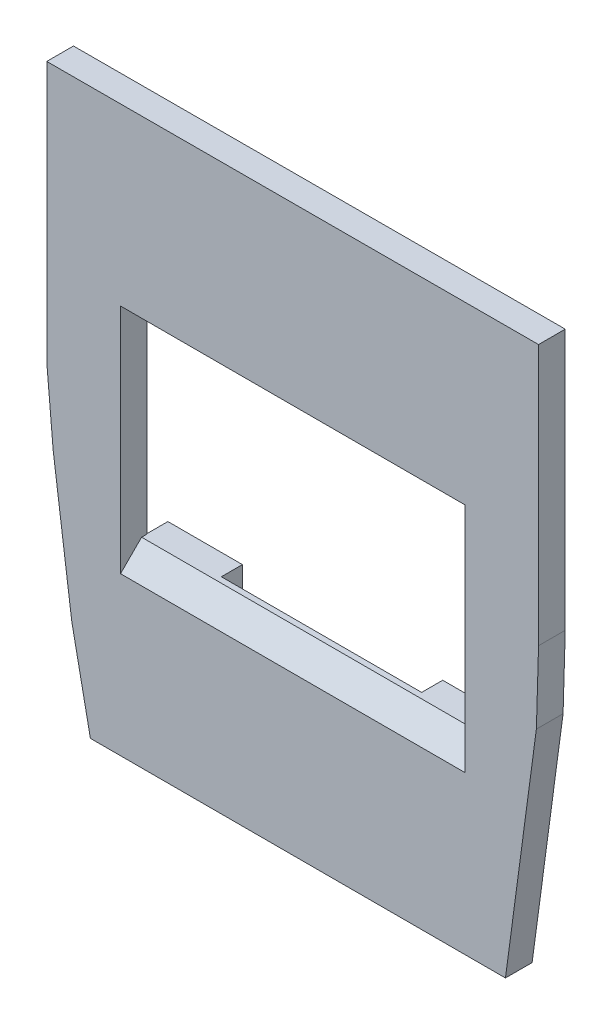
ISO-10303-21;
HEADER;
FILE_DESCRIPTION(('STEP AP214'),'2;1');
FILE_NAME('part.step','',(''),(''),'','','');
FILE_SCHEMA(('AUTOMOTIVE_DESIGN { 1 0 10303 214 1 1 1 1 }'));
ENDSEC;
DATA;
#1=APPLICATION_CONTEXT('core data for automotive mechanical design processes');
#2=APPLICATION_PROTOCOL_DEFINITION('international standard','automotive_design',2000,#1);
#3=PRODUCT_CONTEXT('',#1,'mechanical');
#4=PRODUCT('Part','Part','',(#3));
#5=PRODUCT_RELATED_PRODUCT_CATEGORY('part','',(#4));
#6=PRODUCT_DEFINITION_FORMATION('','',#4);
#7=PRODUCT_DEFINITION_CONTEXT('part definition',#1,'design');
#8=PRODUCT_DEFINITION('design','',#6,#7);
#9=PRODUCT_DEFINITION_SHAPE('','',#8);
#10=(LENGTH_UNIT() NAMED_UNIT(*) SI_UNIT(.MILLI.,.METRE.));
#11=(NAMED_UNIT(*) PLANE_ANGLE_UNIT() SI_UNIT($,.RADIAN.));
#12=(NAMED_UNIT(*) SI_UNIT($,.STERADIAN.) SOLID_ANGLE_UNIT());
#13=UNCERTAINTY_MEASURE_WITH_UNIT(LENGTH_MEASURE(1.E-05),#10,'distance_accuracy_value','');
#14=(GEOMETRIC_REPRESENTATION_CONTEXT(3) GLOBAL_UNCERTAINTY_ASSIGNED_CONTEXT((#13)) GLOBAL_UNIT_ASSIGNED_CONTEXT((#10,
#11,#12)) REPRESENTATION_CONTEXT('',''));
#15=CARTESIAN_POINT('',(0.,0.,0.));
#16=DIRECTION('',(0.,0.,1.));
#17=DIRECTION('',(1.,0.,0.));
#18=AXIS2_PLACEMENT_3D('',#15,#16,#17);
#19=CARTESIAN_POINT('',(0.,0.,0.));
#20=DIRECTION('',(0.,0.,1.));
#21=DIRECTION('',(1.,0.,0.));
#22=AXIS2_PLACEMENT_3D('',#19,#20,#21);
#23=PLANE('',#22);
#24=DIRECTION('',(0.,1.,0.));
#25=VECTOR('',#24,1.);
#26=CARTESIAN_POINT('',(10.6916820346461,10.5403601363045,0.));
#27=LINE('',#26,#25);
#28=CARTESIAN_POINT('',(10.6916820346461,10.5403601363045,0.));
#29=VERTEX_POINT('',#28);
#30=CARTESIAN_POINT('',(10.6916820346461,14.6221120483165,0.));
#31=VERTEX_POINT('',#30);
#32=EDGE_CURVE('E239',#29,#31,#27,.T.);
#33=ORIENTED_EDGE('',*,*,#32,.F.);
#34=DIRECTION('',(1.,0.,0.));
#35=VECTOR('',#34,1.);
#36=CARTESIAN_POINT('',(10.6916820346461,10.5403601363045,0.));
#37=LINE('',#36,#35);
#38=CARTESIAN_POINT('',(15.9958005098485,10.5403601363045,0.));
#39=VERTEX_POINT('',#38);
#40=EDGE_CURVE('E247',#29,#39,#37,.T.);
#41=ORIENTED_EDGE('',*,*,#40,.T.);
#42=DIRECTION('',(0.,1.,0.));
#43=VECTOR('',#42,1.);
#44=CARTESIAN_POINT('',(15.9958005098485,10.5403601363045,0.));
#45=LINE('',#44,#43);
#46=CARTESIAN_POINT('',(15.9958005098485,14.6221120483165,0.));
#47=VERTEX_POINT('',#46);
#48=EDGE_CURVE('E254',#39,#47,#45,.T.);
#49=ORIENTED_EDGE('',*,*,#48,.T.);
#50=DIRECTION('',(1.,0.,0.));
#51=VECTOR('',#50,1.);
#52=CARTESIAN_POINT('',(10.6916820346461,14.6221120483165,0.));
#53=LINE('',#52,#51);
#54=EDGE_CURVE('E48',#31,#47,#53,.T.);
#55=ORIENTED_EDGE('',*,*,#54,.F.);
#56=EDGE_LOOP('',(#33,#41,#49,#55));
#57=FACE_BOUND('',#56,.T.);
#58=DIRECTION('',(0.,-1.,0.));
#59=VECTOR('',#58,1.);
#60=CARTESIAN_POINT('',(5.47123590271081,20.6763208243746,0.));
#61=LINE('',#60,#59);
#62=CARTESIAN_POINT('',(5.47123590271081,20.6763208243746,0.));
#63=VERTEX_POINT('',#62);
#64=CARTESIAN_POINT('',(5.47123590271081,2.16473642803729,0.));
#65=VERTEX_POINT('',#64);
#66=EDGE_CURVE('E382',#63,#65,#61,.T.);
#67=ORIENTED_EDGE('',*,*,#66,.F.);
#68=DIRECTION('',(-0.999998972945766,-0.00143321575949112,0.));
#69=VECTOR('',#68,1.);
#70=CARTESIAN_POINT('',(5.47123590271081,20.6763208243746,0.));
#71=LINE('',#70,#69);
#72=CARTESIAN_POINT('',(40.4711999558126,20.7264833759568,0.));
#73=VERTEX_POINT('',#72);
#74=EDGE_CURVE('E387',#73,#63,#71,.T.);
#75=ORIENTED_EDGE('',*,*,#74,.F.);
#76=DIRECTION('',(0.,1.,0.));
#77=VECTOR('',#76,1.);
#78=CARTESIAN_POINT('',(40.4711999558126,20.7264833759568,0.));
#79=LINE('',#78,#77);
#80=CARTESIAN_POINT('',(40.4711999558126,2.16473642803729,0.));
#81=VERTEX_POINT('',#80);
#82=EDGE_CURVE('E420',#81,#73,#79,.T.);
#83=ORIENTED_EDGE('',*,*,#82,.F.);
#84=DIRECTION('',(0.0295630281202379,0.999562918163915,0.));
#85=VECTOR('',#84,1.);
#86=CARTESIAN_POINT('',(40.3168717193109,-3.05329407294369,0.));
#87=LINE('',#86,#85);
#88=CARTESIAN_POINT('',(40.3168717193109,-3.05329407294369,0.));
#89=VERTEX_POINT('',#88);
#90=EDGE_CURVE('E418',#89,#81,#87,.T.);
#91=ORIENTED_EDGE('',*,*,#90,.F.);
#92=DIRECTION('',(0.132706987579449,0.991155313484011,0.));
#93=VECTOR('',#92,1.);
#94=CARTESIAN_POINT('',(39.0061313007306,-12.8428865742156,0.));
#95=LINE('',#94,#93);
#96=CARTESIAN_POINT('',(38.1155746653007,-19.4942314450822,0.));
#97=VERTEX_POINT('',#96);
#98=EDGE_CURVE('E416',#97,#89,#95,.T.);
#99=ORIENTED_EDGE('',*,*,#98,.F.);
#100=DIRECTION('',(1.,0.,0.));
#101=VECTOR('',#100,1.);
#102=CARTESIAN_POINT('',(38.1155746653007,-19.4942314450822,0.));
#103=LINE('',#102,#101);
#104=CARTESIAN_POINT('',(8.57720643900902,-19.4942314450822,0.));
#105=VERTEX_POINT('',#104);
#106=EDGE_CURVE('E413',#105,#97,#103,.T.);
#107=ORIENTED_EDGE('',*,*,#106,.F.);
#108=DIRECTION('',(0.198501388642258,-0.980100606421144,0.));
#109=VECTOR('',#108,1.);
#110=CARTESIAN_POINT('',(7.25199234352178,-12.950986848614,0.));
#111=LINE('',#110,#109);
#112=CARTESIAN_POINT('',(7.25199234352178,-12.950986848614,0.));
#113=VERTEX_POINT('',#112);
#114=EDGE_CURVE('E410',#113,#105,#111,.T.);
#115=ORIENTED_EDGE('',*,*,#114,.F.);
#116=DIRECTION('',(0.132706987579449,-0.991155313484011,0.));
#117=VECTOR('',#116,1.);
#118=CARTESIAN_POINT('',(5.92677824803454,-3.05329407294369,0.));
#119=LINE('',#118,#117);
#120=CARTESIAN_POINT('',(5.92677824803454,-3.05329407294369,0.));
#121=VERTEX_POINT('',#120);
#122=EDGE_CURVE('E408',#121,#113,#119,.T.);
#123=ORIENTED_EDGE('',*,*,#122,.F.);
#124=DIRECTION('',(0.0869707895483825,-0.996210862099652,0.));
#125=VECTOR('',#124,1.);
#126=CARTESIAN_POINT('',(5.47123590271081,2.16473642803729,0.));
#127=LINE('',#126,#125);
#128=EDGE_CURVE('E406',#65,#121,#127,.T.);
#129=ORIENTED_EDGE('',*,*,#128,.F.);
#130=EDGE_LOOP('',(#67,#75,#83,#91,#99,#107,#115,#123,#129));
#131=FACE_BOUND('',#130,.T.);
#132=DIRECTION('',(-1.,0.,0.));
#133=VECTOR('',#132,1.);
#134=CARTESIAN_POINT('',(35.2211999558126,10.6820636087277,0.));
#135=LINE('',#134,#133);
#136=CARTESIAN_POINT('',(35.2211999558126,10.6820636087277,0.));
#137=VERTEX_POINT('',#136);
#138=CARTESIAN_POINT('',(30.2509607426466,10.6820636087277,0.));
#139=VERTEX_POINT('',#138);
#140=EDGE_CURVE('E333',#137,#139,#135,.T.);
#141=ORIENTED_EDGE('',*,*,#140,.F.);
#142=DIRECTION('',(0.,1.,0.));
#143=VECTOR('',#142,1.);
#144=CARTESIAN_POINT('',(35.2211999558126,10.6820636087277,0.));
#145=LINE('',#144,#143);
#146=CARTESIAN_POINT('',(35.2211999558126,14.6221120483165,0.));
#147=VERTEX_POINT('',#146);
#148=EDGE_CURVE('E320',#137,#147,#145,.T.);
#149=ORIENTED_EDGE('',*,*,#148,.T.);
#150=DIRECTION('',(-1.,0.,0.));
#151=VECTOR('',#150,1.);
#152=CARTESIAN_POINT('',(35.2211999558126,14.6221120483165,0.));
#153=LINE('',#152,#151);
#154=CARTESIAN_POINT('',(30.2509607426466,14.6221120483165,0.));
#155=VERTEX_POINT('',#154);
#156=EDGE_CURVE('E343',#147,#155,#153,.T.);
#157=ORIENTED_EDGE('',*,*,#156,.T.);
#158=DIRECTION('',(0.,1.,0.));
#159=VECTOR('',#158,1.);
#160=CARTESIAN_POINT('',(30.2509607426466,10.6820636087277,0.));
#161=LINE('',#160,#159);
#162=EDGE_CURVE('E346',#139,#155,#161,.T.);
#163=ORIENTED_EDGE('',*,*,#162,.F.);
#164=EDGE_LOOP('',(#141,#149,#157,#163));
#165=FACE_BOUND('',#164,.T.);
#166=DIRECTION('',(0.,-1.,0.));
#167=VECTOR('',#166,1.);
#168=CARTESIAN_POINT('',(35.2211999558126,-6.77351662404319,0.));
#169=LINE('',#168,#167);
#170=CARTESIAN_POINT('',(35.2211999558126,-6.77351662404319,0.));
#171=VERTEX_POINT('',#170);
#172=CARTESIAN_POINT('',(35.2211999558126,-11.7735166240432,0.));
#173=VERTEX_POINT('',#172);
#174=EDGE_CURVE('E282',#171,#173,#169,.T.);
#175=ORIENTED_EDGE('',*,*,#174,.F.);
#176=DIRECTION('',(0.,1.,0.));
#177=VECTOR('',#176,1.);
#178=CARTESIAN_POINT('',(35.2211999558126,-6.77351662404319,0.));
#179=LINE('',#178,#177);
#180=CARTESIAN_POINT('',(35.2211999558126,6.72648337595681,0.));
#181=VERTEX_POINT('',#180);
#182=EDGE_CURVE('E362',#171,#181,#179,.T.);
#183=ORIENTED_EDGE('',*,*,#182,.T.);
#184=DIRECTION('',(-1.,0.,0.));
#185=VECTOR('',#184,1.);
#186=CARTESIAN_POINT('',(35.2211999558126,6.72648337595681,0.));
#187=LINE('',#186,#185);
#188=CARTESIAN_POINT('',(10.7212359027108,6.72648337595681,0.));
#189=VERTEX_POINT('',#188);
#190=EDGE_CURVE('E351',#181,#189,#187,.T.);
#191=ORIENTED_EDGE('',*,*,#190,.T.);
#192=DIRECTION('',(0.,-1.,0.));
#193=VECTOR('',#192,1.);
#194=CARTESIAN_POINT('',(10.7212359027108,-6.77351662404319,0.));
#195=LINE('',#194,#193);
#196=CARTESIAN_POINT('',(10.7212359027108,-6.77351662404319,0.));
#197=VERTEX_POINT('',#196);
#198=EDGE_CURVE('E367',#189,#197,#195,.T.);
#199=ORIENTED_EDGE('',*,*,#198,.T.);
#200=DIRECTION('',(-1.,0.,0.));
#201=VECTOR('',#200,1.);
#202=CARTESIAN_POINT('',(15.9958005098485,-6.77351662404319,0.));
#203=LINE('',#202,#201);
#204=CARTESIAN_POINT('',(10.6916820346461,-6.77351662404319,0.));
#205=VERTEX_POINT('',#204);
#206=EDGE_CURVE('E318',#197,#205,#203,.T.);
#207=ORIENTED_EDGE('',*,*,#206,.T.);
#208=DIRECTION('',(0.,-1.,0.));
#209=VECTOR('',#208,1.);
#210=CARTESIAN_POINT('',(10.6916820346461,-6.77351662404319,0.));
#211=LINE('',#210,#209);
#212=CARTESIAN_POINT('',(10.6916820346461,-11.7735166240432,0.));
#213=VERTEX_POINT('',#212);
#214=EDGE_CURVE('E316',#205,#213,#211,.T.);
#215=ORIENTED_EDGE('',*,*,#214,.T.);
#216=DIRECTION('',(-1.,0.,0.));
#217=VECTOR('',#216,1.);
#218=CARTESIAN_POINT('',(15.9958005098485,-11.7735166240432,0.));
#219=LINE('',#218,#217);
#220=CARTESIAN_POINT('',(15.9958005098485,-11.7735166240432,0.));
#221=VERTEX_POINT('',#220);
#222=EDGE_CURVE('E312',#221,#213,#219,.T.);
#223=ORIENTED_EDGE('',*,*,#222,.F.);
#224=DIRECTION('',(0.,-1.,0.));
#225=VECTOR('',#224,1.);
#226=CARTESIAN_POINT('',(15.9958005098485,-6.77351662404319,0.));
#227=LINE('',#226,#225);
#228=CARTESIAN_POINT('',(15.9958005098485,-6.77351662404319,0.));
#229=VERTEX_POINT('',#228);
#230=EDGE_CURVE('E309',#229,#221,#227,.T.);
#231=ORIENTED_EDGE('',*,*,#230,.F.);
#232=DIRECTION('',(1.,0.,0.));
#233=VECTOR('',#232,1.);
#234=CARTESIAN_POINT('',(10.7212359027108,-6.77351662404319,0.));
#235=LINE('',#234,#233);
#236=CARTESIAN_POINT('',(30.2509607426466,-6.77351662404319,0.));
#237=VERTEX_POINT('',#236);
#238=EDGE_CURVE('E370',#229,#237,#235,.T.);
#239=ORIENTED_EDGE('',*,*,#238,.T.);
#240=DIRECTION('',(0.,-1.,0.));
#241=VECTOR('',#240,1.);
#242=CARTESIAN_POINT('',(30.2509607426466,-6.77351662404319,0.));
#243=LINE('',#242,#241);
#244=CARTESIAN_POINT('',(30.2509607426466,-11.7735166240432,0.));
#245=VERTEX_POINT('',#244);
#246=EDGE_CURVE('E286',#237,#245,#243,.T.);
#247=ORIENTED_EDGE('',*,*,#246,.T.);
#248=DIRECTION('',(-1.,0.,0.));
#249=VECTOR('',#248,1.);
#250=CARTESIAN_POINT('',(35.2211999558126,-11.7735166240432,0.));
#251=LINE('',#250,#249);
#252=EDGE_CURVE('E56',#173,#245,#251,.T.);
#253=ORIENTED_EDGE('',*,*,#252,.F.);
#254=EDGE_LOOP('',(#175,#183,#191,#199,#207,#215,#223,#231,#239,#247,#253));
#255=FACE_BOUND('',#254,.T.);
#256=ADVANCED_FACE('F33',(#57,#131,#165,#255),#23,.F.);
#257=CARTESIAN_POINT('',(0.,0.,1.9));
#258=DIRECTION('',(0.,0.,1.));
#259=DIRECTION('',(1.,0.,0.));
#260=AXIS2_PLACEMENT_3D('',#257,#258,#259);
#261=PLANE('',#260);
#262=DIRECTION('',(0.,-1.,0.));
#263=VECTOR('',#262,1.);
#264=CARTESIAN_POINT('',(5.47123590271081,20.6763208243746,1.9));
#265=LINE('',#264,#263);
#266=CARTESIAN_POINT('',(5.47123590271081,20.6763208243746,1.9));
#267=VERTEX_POINT('',#266);
#268=CARTESIAN_POINT('',(5.47123590271081,2.16473642803729,1.9));
#269=VERTEX_POINT('',#268);
#270=EDGE_CURVE('E383',#267,#269,#265,.T.);
#271=ORIENTED_EDGE('',*,*,#270,.T.);
#272=DIRECTION('',(0.0869707895483825,-0.996210862099652,0.));
#273=VECTOR('',#272,1.);
#274=CARTESIAN_POINT('',(5.47123590271081,2.16473642803729,1.9));
#275=LINE('',#274,#273);
#276=CARTESIAN_POINT('',(5.92677824803454,-3.05329407294369,1.9));
#277=VERTEX_POINT('',#276);
#278=EDGE_CURVE('E386',#269,#277,#275,.T.);
#279=ORIENTED_EDGE('',*,*,#278,.T.);
#280=DIRECTION('',(0.132706987579449,-0.991155313484011,0.));
#281=VECTOR('',#280,1.);
#282=CARTESIAN_POINT('',(5.92677824803454,-3.05329407294369,1.9));
#283=LINE('',#282,#281);
#284=CARTESIAN_POINT('',(7.25199234352178,-12.950986848614,1.9));
#285=VERTEX_POINT('',#284);
#286=EDGE_CURVE('E389',#277,#285,#283,.T.);
#287=ORIENTED_EDGE('',*,*,#286,.T.);
#288=DIRECTION('',(0.198501388642258,-0.980100606421144,0.));
#289=VECTOR('',#288,1.);
#290=CARTESIAN_POINT('',(7.25199234352178,-12.950986848614,1.9));
#291=LINE('',#290,#289);
#292=CARTESIAN_POINT('',(8.57720643900902,-19.4942314450822,1.9));
#293=VERTEX_POINT('',#292);
#294=EDGE_CURVE('E391',#285,#293,#291,.T.);
#295=ORIENTED_EDGE('',*,*,#294,.T.);
#296=DIRECTION('',(1.,0.,0.));
#297=VECTOR('',#296,1.);
#298=CARTESIAN_POINT('',(8.57720643900902,-19.4942314450822,1.9));
#299=LINE('',#298,#297);
#300=CARTESIAN_POINT('',(38.1155746653007,-19.4942314450822,1.9));
#301=VERTEX_POINT('',#300);
#302=EDGE_CURVE('E393',#293,#301,#299,.T.);
#303=ORIENTED_EDGE('',*,*,#302,.T.);
#304=DIRECTION('',(0.132706987579449,0.991155313484011,0.));
#305=VECTOR('',#304,1.);
#306=CARTESIAN_POINT('',(38.1155746653007,-19.4942314450822,1.9));
#307=LINE('',#306,#305);
#308=CARTESIAN_POINT('',(40.3168717193109,-3.05329407294369,1.9));
#309=VERTEX_POINT('',#308);
#310=EDGE_CURVE('E395',#301,#309,#307,.T.);
#311=ORIENTED_EDGE('',*,*,#310,.T.);
#312=DIRECTION('',(0.0295630281202379,0.999562918163915,0.));
#313=VECTOR('',#312,1.);
#314=CARTESIAN_POINT('',(40.3168717193109,-3.05329407294369,1.9));
#315=LINE('',#314,#313);
#316=CARTESIAN_POINT('',(40.4711999558126,2.16473642803729,1.9));
#317=VERTEX_POINT('',#316);
#318=EDGE_CURVE('E397',#309,#317,#315,.T.);
#319=ORIENTED_EDGE('',*,*,#318,.T.);
#320=DIRECTION('',(0.,1.,0.));
#321=VECTOR('',#320,1.);
#322=CARTESIAN_POINT('',(40.4711999558126,20.7264833759568,1.9));
#323=LINE('',#322,#321);
#324=CARTESIAN_POINT('',(40.4711999558126,20.7264833759568,1.9));
#325=VERTEX_POINT('',#324);
#326=EDGE_CURVE('E399',#317,#325,#323,.T.);
#327=ORIENTED_EDGE('',*,*,#326,.T.);
#328=DIRECTION('',(-0.999998972945766,-0.00143321575949112,0.));
#329=VECTOR('',#328,1.);
#330=CARTESIAN_POINT('',(5.47123590271081,20.6763208243746,1.9));
#331=LINE('',#330,#329);
#332=EDGE_CURVE('E401',#325,#267,#331,.T.);
#333=ORIENTED_EDGE('',*,*,#332,.T.);
#334=EDGE_LOOP('',(#271,#279,#287,#295,#303,#311,#319,#327,#333));
#335=FACE_BOUND('',#334,.T.);
#336=DIRECTION('',(0.,-1.,0.));
#337=VECTOR('',#336,1.);
#338=CARTESIAN_POINT('',(10.7212359027108,-6.77351662404319,1.9));
#339=LINE('',#338,#337);
#340=CARTESIAN_POINT('',(10.7212359027108,8.22648337595681,1.9));
#341=VERTEX_POINT('',#340);
#342=CARTESIAN_POINT('',(10.7212359027108,-8.27351662404319,1.9));
#343=VERTEX_POINT('',#342);
#344=EDGE_CURVE('E359',#341,#343,#339,.T.);
#345=ORIENTED_EDGE('',*,*,#344,.F.);
#346=DIRECTION('',(1.,0.,0.));
#347=VECTOR('',#346,1.);
#348=CARTESIAN_POINT('',(0.,8.22648337595681,1.9));
#349=LINE('',#348,#347);
#350=CARTESIAN_POINT('',(35.2211999558126,8.22648337595681,1.9));
#351=VERTEX_POINT('',#350);
#352=EDGE_CURVE('E455',#341,#351,#349,.T.);
#353=ORIENTED_EDGE('',*,*,#352,.T.);
#354=DIRECTION('',(0.,1.,0.));
#355=VECTOR('',#354,1.);
#356=CARTESIAN_POINT('',(35.2211999558126,-6.77351662404319,1.9));
#357=LINE('',#356,#355);
#358=CARTESIAN_POINT('',(35.2211999558126,-8.27351662404319,1.9));
#359=VERTEX_POINT('',#358);
#360=EDGE_CURVE('E361',#359,#351,#357,.T.);
#361=ORIENTED_EDGE('',*,*,#360,.F.);
#362=DIRECTION('',(-1.,0.,0.));
#363=VECTOR('',#362,1.);
#364=CARTESIAN_POINT('',(0.,-8.27351662404319,1.9));
#365=LINE('',#364,#363);
#366=EDGE_CURVE('E452',#359,#343,#365,.T.);
#367=ORIENTED_EDGE('',*,*,#366,.T.);
#368=EDGE_LOOP('',(#345,#353,#361,#367));
#369=FACE_BOUND('',#368,.T.);
#370=ADVANCED_FACE('F474',(#335,#369),#261,.T.);
#371=CARTESIAN_POINT('',(5.47123590271081,20.6763208243746,1.9));
#372=DIRECTION('',(1.,0.,0.));
#373=DIRECTION('',(0.,0.,-1.));
#374=AXIS2_PLACEMENT_3D('',#371,#372,#373);
#375=PLANE('',#374);
#376=ORIENTED_EDGE('',*,*,#66,.T.);
#377=DIRECTION('',(0.,0.,-1.));
#378=VECTOR('',#377,1.);
#379=CARTESIAN_POINT('',(5.47123590271081,2.16473642803729,1.9));
#380=LINE('',#379,#378);
#381=EDGE_CURVE('E446',#269,#65,#380,.T.);
#382=ORIENTED_EDGE('',*,*,#381,.F.);
#383=ORIENTED_EDGE('',*,*,#270,.F.);
#384=DIRECTION('',(0.,0.,-1.));
#385=VECTOR('',#384,1.);
#386=CARTESIAN_POINT('',(5.47123590271081,20.6763208243746,1.9));
#387=LINE('',#386,#385);
#388=EDGE_CURVE('E403',#267,#63,#387,.T.);
#389=ORIENTED_EDGE('',*,*,#388,.T.);
#390=EDGE_LOOP('',(#376,#382,#383,#389));
#391=FACE_BOUND('',#390,.T.);
#392=ADVANCED_FACE('F536',(#391),#375,.F.);
#393=CARTESIAN_POINT('',(5.47123590271081,2.16473642803729,1.9));
#394=DIRECTION('',(0.996210862099651,0.0869707895483825,0.));
#395=DIRECTION('',(-0.0869707895483825,0.996210862099652,0.));
#396=AXIS2_PLACEMENT_3D('',#393,#394,#395);
#397=PLANE('',#396);
#398=ORIENTED_EDGE('',*,*,#128,.T.);
#399=DIRECTION('',(0.,0.,-1.));
#400=VECTOR('',#399,1.);
#401=CARTESIAN_POINT('',(5.92677824803454,-3.05329407294369,1.9));
#402=LINE('',#401,#400);
#403=EDGE_CURVE('E443',#277,#121,#402,.T.);
#404=ORIENTED_EDGE('',*,*,#403,.F.);
#405=ORIENTED_EDGE('',*,*,#278,.F.);
#406=ORIENTED_EDGE('',*,*,#381,.T.);
#407=EDGE_LOOP('',(#398,#404,#405,#406));
#408=FACE_BOUND('',#407,.T.);
#409=ADVANCED_FACE('F568',(#408),#397,.F.);
#410=CARTESIAN_POINT('',(5.92677824803454,-3.05329407294369,1.9));
#411=DIRECTION('',(0.991155313484011,0.132706987579449,0.));
#412=DIRECTION('',(-0.132706987579449,0.991155313484011,0.));
#413=AXIS2_PLACEMENT_3D('',#410,#411,#412);
#414=PLANE('',#413);
#415=ORIENTED_EDGE('',*,*,#122,.T.);
#416=DIRECTION('',(0.,0.,-1.));
#417=VECTOR('',#416,1.);
#418=CARTESIAN_POINT('',(7.25199234352178,-12.950986848614,1.9));
#419=LINE('',#418,#417);
#420=EDGE_CURVE('E440',#285,#113,#419,.T.);
#421=ORIENTED_EDGE('',*,*,#420,.F.);
#422=ORIENTED_EDGE('',*,*,#286,.F.);
#423=ORIENTED_EDGE('',*,*,#403,.T.);
#424=EDGE_LOOP('',(#415,#421,#422,#423));
#425=FACE_BOUND('',#424,.T.);
#426=ADVANCED_FACE('F564',(#425),#414,.F.);
#427=CARTESIAN_POINT('',(7.25199234352178,-12.950986848614,1.9));
#428=DIRECTION('',(0.980100606421144,0.198501388642258,0.));
#429=DIRECTION('',(-0.198501388642258,0.980100606421145,0.));
#430=AXIS2_PLACEMENT_3D('',#427,#428,#429);
#431=PLANE('',#430);
#432=ORIENTED_EDGE('',*,*,#114,.T.);
#433=DIRECTION('',(0.,0.,-1.));
#434=VECTOR('',#433,1.);
#435=CARTESIAN_POINT('',(8.57720643900902,-19.4942314450822,1.9));
#436=LINE('',#435,#434);
#437=EDGE_CURVE('E437',#293,#105,#436,.T.);
#438=ORIENTED_EDGE('',*,*,#437,.F.);
#439=ORIENTED_EDGE('',*,*,#294,.F.);
#440=ORIENTED_EDGE('',*,*,#420,.T.);
#441=EDGE_LOOP('',(#432,#438,#439,#440));
#442=FACE_BOUND('',#441,.T.);
#443=ADVANCED_FACE('F560',(#442),#431,.F.);
#444=CARTESIAN_POINT('',(38.1155746653007,-19.4942314450822,1.9));
#445=DIRECTION('',(0.,1.,0.));
#446=DIRECTION('',(0.,0.,1.));
#447=AXIS2_PLACEMENT_3D('',#444,#445,#446);
#448=PLANE('',#447);
#449=ORIENTED_EDGE('',*,*,#106,.T.);
#450=DIRECTION('',(0.,0.,-1.));
#451=VECTOR('',#450,1.);
#452=CARTESIAN_POINT('',(38.1155746653007,-19.4942314450822,1.9));
#453=LINE('',#452,#451);
#454=EDGE_CURVE('E434',#301,#97,#453,.T.);
#455=ORIENTED_EDGE('',*,*,#454,.F.);
#456=ORIENTED_EDGE('',*,*,#302,.F.);
#457=ORIENTED_EDGE('',*,*,#437,.T.);
#458=EDGE_LOOP('',(#449,#455,#456,#457));
#459=FACE_BOUND('',#458,.T.);
#460=ADVANCED_FACE('F556',(#459),#448,.F.);
#461=CARTESIAN_POINT('',(39.0061313007306,-12.8428865742156,1.9));
#462=DIRECTION('',(-0.991155313484011,0.132706987579449,0.));
#463=DIRECTION('',(-0.132706987579449,-0.991155313484011,0.));
#464=AXIS2_PLACEMENT_3D('',#461,#462,#463);
#465=PLANE('',#464);
#466=ORIENTED_EDGE('',*,*,#98,.T.);
#467=DIRECTION('',(0.,0.,-1.));
#468=VECTOR('',#467,1.);
#469=CARTESIAN_POINT('',(40.3168717193109,-3.05329407294369,1.9));
#470=LINE('',#469,#468);
#471=EDGE_CURVE('E431',#309,#89,#470,.T.);
#472=ORIENTED_EDGE('',*,*,#471,.F.);
#473=ORIENTED_EDGE('',*,*,#310,.F.);
#474=ORIENTED_EDGE('',*,*,#454,.T.);
#475=EDGE_LOOP('',(#466,#472,#473,#474));
#476=FACE_BOUND('',#475,.T.);
#477=ADVANCED_FACE('F552',(#476),#465,.F.);
#478=CARTESIAN_POINT('',(40.3168717193109,-3.05329407294369,1.9));
#479=DIRECTION('',(-0.999562918163915,0.0295630281202379,0.));
#480=DIRECTION('',(-0.0295630281202379,-0.999562918163915,0.));
#481=AXIS2_PLACEMENT_3D('',#478,#479,#480);
#482=PLANE('',#481);
#483=ORIENTED_EDGE('',*,*,#90,.T.);
#484=DIRECTION('',(0.,0.,-1.));
#485=VECTOR('',#484,1.);
#486=CARTESIAN_POINT('',(40.4711999558126,2.16473642803729,1.9));
#487=LINE('',#486,#485);
#488=EDGE_CURVE('E428',#317,#81,#487,.T.);
#489=ORIENTED_EDGE('',*,*,#488,.F.);
#490=ORIENTED_EDGE('',*,*,#318,.F.);
#491=ORIENTED_EDGE('',*,*,#471,.T.);
#492=EDGE_LOOP('',(#483,#489,#490,#491));
#493=FACE_BOUND('',#492,.T.);
#494=ADVANCED_FACE('F548',(#493),#482,.F.);
#495=CARTESIAN_POINT('',(40.4711999558126,20.7264833759568,1.9));
#496=DIRECTION('',(-1.,0.,0.));
#497=DIRECTION('',(0.,0.,1.));
#498=AXIS2_PLACEMENT_3D('',#495,#496,#497);
#499=PLANE('',#498);
#500=ORIENTED_EDGE('',*,*,#82,.T.);
#501=DIRECTION('',(0.,0.,-1.));
#502=VECTOR('',#501,1.);
#503=CARTESIAN_POINT('',(40.4711999558126,20.7264833759568,1.9));
#504=LINE('',#503,#502);
#505=EDGE_CURVE('E425',#325,#73,#504,.T.);
#506=ORIENTED_EDGE('',*,*,#505,.F.);
#507=ORIENTED_EDGE('',*,*,#326,.F.);
#508=ORIENTED_EDGE('',*,*,#488,.T.);
#509=EDGE_LOOP('',(#500,#506,#507,#508));
#510=FACE_BOUND('',#509,.T.);
#511=ADVANCED_FACE('F544',(#510),#499,.F.);
#512=CARTESIAN_POINT('',(5.47123590271081,20.6763208243746,1.9));
#513=DIRECTION('',(0.00143321575949112,-0.999998972945766,0.));
#514=DIRECTION('',(0.999998972945766,0.00143321575949112,0.));
#515=AXIS2_PLACEMENT_3D('',#512,#513,#514);
#516=PLANE('',#515);
#517=ORIENTED_EDGE('',*,*,#74,.T.);
#518=ORIENTED_EDGE('',*,*,#388,.F.);
#519=ORIENTED_EDGE('',*,*,#332,.F.);
#520=ORIENTED_EDGE('',*,*,#505,.T.);
#521=EDGE_LOOP('',(#517,#518,#519,#520));
#522=FACE_BOUND('',#521,.T.);
#523=ADVANCED_FACE('F541',(#522),#516,.F.);
#524=CARTESIAN_POINT('',(35.2211999558126,6.72648337595681,1.9));
#525=DIRECTION('',(0.,-1.,0.));
#526=DIRECTION('',(1.,0.,0.));
#527=AXIS2_PLACEMENT_3D('',#524,#525,#526);
#528=PLANE('',#527);
#529=DIRECTION('',(0.,0.,-1.));
#530=VECTOR('',#529,1.);
#531=CARTESIAN_POINT('',(35.2211999558126,6.72648337595681,1.9));
#532=LINE('',#531,#530);
#533=CARTESIAN_POINT('',(35.2211999558126,6.72648337595681,0.400000000000006));
#534=VERTEX_POINT('',#533);
#535=EDGE_CURVE('E364',#534,#181,#532,.T.);
#536=ORIENTED_EDGE('',*,*,#535,.F.);
#537=DIRECTION('',(-1.,0.,0.));
#538=VECTOR('',#537,1.);
#539=CARTESIAN_POINT('',(35.2211999558126,6.72648337595681,0.400000000000006));
#540=LINE('',#539,#538);
#541=CARTESIAN_POINT('',(10.7212359027108,6.72648337595681,0.400000000000006));
#542=VERTEX_POINT('',#541);
#543=EDGE_CURVE('E449',#534,#542,#540,.T.);
#544=ORIENTED_EDGE('',*,*,#543,.T.);
#545=DIRECTION('',(0.,0.,-1.));
#546=VECTOR('',#545,1.);
#547=CARTESIAN_POINT('',(10.7212359027108,6.72648337595681,1.9));
#548=LINE('',#547,#546);
#549=EDGE_CURVE('E380',#542,#189,#548,.T.);
#550=ORIENTED_EDGE('',*,*,#549,.T.);
#551=ORIENTED_EDGE('',*,*,#190,.F.);
#552=EDGE_LOOP('',(#536,#544,#550,#551));
#553=FACE_BOUND('',#552,.T.);
#554=ADVANCED_FACE('F483',(#553),#528,.T.);
#555=CARTESIAN_POINT('',(10.7212359027108,-6.77351662404319,1.9));
#556=DIRECTION('',(1.,0.,0.));
#557=DIRECTION('',(0.,0.,-1.));
#558=AXIS2_PLACEMENT_3D('',#555,#556,#557);
#559=PLANE('',#558);
#560=ORIENTED_EDGE('',*,*,#198,.F.);
#561=ORIENTED_EDGE('',*,*,#549,.F.);
#562=DIRECTION('',(0.,-0.707106781186549,-0.707106781186546));
#563=VECTOR('',#562,1.);
#564=CARTESIAN_POINT('',(10.7212359027108,6.72648337595681,0.400000000000005));
#565=LINE('',#564,#563);
#566=EDGE_CURVE('E461',#542,#341,#565,.F.);
#567=ORIENTED_EDGE('',*,*,#566,.T.);
#568=ORIENTED_EDGE('',*,*,#344,.T.);
#569=DIRECTION('',(0.,-0.707106781186549,0.707106781186546));
#570=VECTOR('',#569,1.);
#571=CARTESIAN_POINT('',(10.7212359027108,-6.77351662404319,0.400000000000006));
#572=LINE('',#571,#570);
#573=CARTESIAN_POINT('',(10.7212359027108,-6.77351662404319,0.400000000000006));
#574=VERTEX_POINT('',#573);
#575=EDGE_CURVE('E11',#343,#574,#572,.F.);
#576=ORIENTED_EDGE('',*,*,#575,.T.);
#577=DIRECTION('',(0.,0.,-1.));
#578=VECTOR('',#577,1.);
#579=CARTESIAN_POINT('',(10.7212359027108,-6.77351662404319,1.9));
#580=LINE('',#579,#578);
#581=EDGE_CURVE('E378',#574,#197,#580,.T.);
#582=ORIENTED_EDGE('',*,*,#581,.T.);
#583=EDGE_LOOP('',(#560,#561,#567,#568,#576,#582));
#584=FACE_BOUND('',#583,.T.);
#585=ADVANCED_FACE('F492',(#584),#559,.T.);
#586=CARTESIAN_POINT('',(10.7212359027108,-6.77351662404319,1.9));
#587=DIRECTION('',(0.,1.,0.));
#588=DIRECTION('',(-1.,0.,0.));
#589=AXIS2_PLACEMENT_3D('',#586,#587,#588);
#590=PLANE('',#589);
#591=ORIENTED_EDGE('',*,*,#581,.F.);
#592=DIRECTION('',(1.,0.,0.));
#593=VECTOR('',#592,1.);
#594=CARTESIAN_POINT('',(10.7212359027108,-6.77351662404319,0.400000000000006));
#595=LINE('',#594,#593);
#596=CARTESIAN_POINT('',(35.2211999558126,-6.77351662404319,0.400000000000006));
#597=VERTEX_POINT('',#596);
#598=EDGE_CURVE('E458',#574,#597,#595,.T.);
#599=ORIENTED_EDGE('',*,*,#598,.T.);
#600=DIRECTION('',(0.,0.,-1.));
#601=VECTOR('',#600,1.);
#602=CARTESIAN_POINT('',(35.2211999558126,-6.77351662404319,1.9));
#603=LINE('',#602,#601);
#604=EDGE_CURVE('E375',#597,#171,#603,.T.);
#605=ORIENTED_EDGE('',*,*,#604,.T.);
#606=DIRECTION('',(0.,0.,1.));
#607=VECTOR('',#606,1.);
#608=CARTESIAN_POINT('',(35.2211999558126,-6.77351662404319,-1.5));
#609=LINE('',#608,#607);
#610=CARTESIAN_POINT('',(35.2211999558126,-6.77351662404319,-1.5));
#611=VERTEX_POINT('',#610);
#612=EDGE_CURVE('E253',#611,#171,#609,.T.);
#613=ORIENTED_EDGE('',*,*,#612,.F.);
#614=DIRECTION('',(-1.,0.,0.));
#615=VECTOR('',#614,1.);
#616=CARTESIAN_POINT('',(35.2211999558126,-6.77351662404319,-1.5));
#617=LINE('',#616,#615);
#618=CARTESIAN_POINT('',(30.2509607426466,-6.77351662404319,-1.5));
#619=VERTEX_POINT('',#618);
#620=EDGE_CURVE('E284',#611,#619,#617,.T.);
#621=ORIENTED_EDGE('',*,*,#620,.T.);
#622=DIRECTION('',(0.,0.,1.));
#623=VECTOR('',#622,1.);
#624=CARTESIAN_POINT('',(30.2509607426466,-6.77351662404319,-1.5));
#625=LINE('',#624,#623);
#626=EDGE_CURVE('E270',#619,#237,#625,.T.);
#627=ORIENTED_EDGE('',*,*,#626,.T.);
#628=ORIENTED_EDGE('',*,*,#238,.F.);
#629=DIRECTION('',(0.,0.,1.));
#630=VECTOR('',#629,1.);
#631=CARTESIAN_POINT('',(15.9958005098485,-6.77351662404319,-1.5));
#632=LINE('',#631,#630);
#633=CARTESIAN_POINT('',(15.9958005098485,-6.77351662404319,-1.5));
#634=VERTEX_POINT('',#633);
#635=EDGE_CURVE('E288',#634,#229,#632,.T.);
#636=ORIENTED_EDGE('',*,*,#635,.F.);
#637=DIRECTION('',(-1.,0.,0.));
#638=VECTOR('',#637,1.);
#639=CARTESIAN_POINT('',(15.9958005098485,-6.77351662404319,-1.5));
#640=LINE('',#639,#638);
#641=CARTESIAN_POINT('',(10.6916820346461,-6.77351662404319,-1.5));
#642=VERTEX_POINT('',#641);
#643=EDGE_CURVE('E313',#634,#642,#640,.T.);
#644=ORIENTED_EDGE('',*,*,#643,.T.);
#645=DIRECTION('',(0.,0.,1.));
#646=VECTOR('',#645,1.);
#647=CARTESIAN_POINT('',(10.6916820346461,-6.77351662404319,-1.5));
#648=LINE('',#647,#646);
#649=EDGE_CURVE('E297',#642,#205,#648,.T.);
#650=ORIENTED_EDGE('',*,*,#649,.T.);
#651=ORIENTED_EDGE('',*,*,#206,.F.);
#652=EDGE_LOOP('',(#591,#599,#605,#613,#621,#627,#628,#636,#644,#650,#651));
#653=FACE_BOUND('',#652,.T.);
#654=ADVANCED_FACE('F488',(#653),#590,.T.);
#655=CARTESIAN_POINT('',(35.2211999558126,-6.77351662404319,1.9));
#656=DIRECTION('',(-1.,0.,0.));
#657=DIRECTION('',(0.,0.,1.));
#658=AXIS2_PLACEMENT_3D('',#655,#656,#657);
#659=PLANE('',#658);
#660=ORIENTED_EDGE('',*,*,#182,.F.);
#661=ORIENTED_EDGE('',*,*,#604,.F.);
#662=DIRECTION('',(0.,0.707106781186549,-0.707106781186546));
#663=VECTOR('',#662,1.);
#664=CARTESIAN_POINT('',(35.2211999558126,-6.77351662404319,0.400000000000005));
#665=LINE('',#664,#663);
#666=EDGE_CURVE('E41',#597,#359,#665,.F.);
#667=ORIENTED_EDGE('',*,*,#666,.T.);
#668=ORIENTED_EDGE('',*,*,#360,.T.);
#669=DIRECTION('',(0.,0.707106781186549,0.707106781186546));
#670=VECTOR('',#669,1.);
#671=CARTESIAN_POINT('',(35.2211999558126,6.72648337595681,0.400000000000006));
#672=LINE('',#671,#670);
#673=EDGE_CURVE('E464',#351,#534,#672,.F.);
#674=ORIENTED_EDGE('',*,*,#673,.T.);
#675=ORIENTED_EDGE('',*,*,#535,.T.);
#676=EDGE_LOOP('',(#660,#661,#667,#668,#674,#675));
#677=FACE_BOUND('',#676,.T.);
#678=ADVANCED_FACE('F469',(#677),#659,.T.);
#679=CARTESIAN_POINT('',(35.2211999558126,6.72648337595681,0.400000000000006));
#680=DIRECTION('',(0.,0.707106781186546,-0.707106781186549));
#681=DIRECTION('',(-1.,0.,0.));
#682=AXIS2_PLACEMENT_3D('',#679,#680,#681);
#683=PLANE('',#682);
#684=ORIENTED_EDGE('',*,*,#673,.F.);
#685=ORIENTED_EDGE('',*,*,#352,.F.);
#686=ORIENTED_EDGE('',*,*,#566,.F.);
#687=ORIENTED_EDGE('',*,*,#543,.F.);
#688=EDGE_LOOP('',(#684,#685,#686,#687));
#689=FACE_BOUND('',#688,.T.);
#690=ADVANCED_FACE('F479',(#689),#683,.F.);
#691=CARTESIAN_POINT('',(10.7212359027108,-6.77351662404319,0.400000000000006));
#692=DIRECTION('',(0.,-0.707106781186546,-0.707106781186549));
#693=DIRECTION('',(1.,0.,0.));
#694=AXIS2_PLACEMENT_3D('',#691,#692,#693);
#695=PLANE('',#694);
#696=ORIENTED_EDGE('',*,*,#575,.F.);
#697=ORIENTED_EDGE('',*,*,#366,.F.);
#698=ORIENTED_EDGE('',*,*,#666,.F.);
#699=ORIENTED_EDGE('',*,*,#598,.F.);
#700=EDGE_LOOP('',(#696,#697,#698,#699));
#701=FACE_BOUND('',#700,.T.);
#702=ADVANCED_FACE('F35',(#701),#695,.F.);
#703=CARTESIAN_POINT('',(35.2211999558126,10.6820636087277,-1.5));
#704=DIRECTION('',(1.,0.,0.));
#705=DIRECTION('',(0.,0.,-1.));
#706=AXIS2_PLACEMENT_3D('',#703,#704,#705);
#707=PLANE('',#706);
#708=ORIENTED_EDGE('',*,*,#148,.F.);
#709=DIRECTION('',(0.,0.,1.));
#710=VECTOR('',#709,1.);
#711=CARTESIAN_POINT('',(35.2211999558126,10.6820636087277,-1.5));
#712=LINE('',#711,#710);
#713=CARTESIAN_POINT('',(35.2211999558126,10.6820636087277,-1.5));
#714=VERTEX_POINT('',#713);
#715=EDGE_CURVE('E349',#714,#137,#712,.T.);
#716=ORIENTED_EDGE('',*,*,#715,.F.);
#717=DIRECTION('',(0.,1.,0.));
#718=VECTOR('',#717,1.);
#719=CARTESIAN_POINT('',(35.2211999558126,10.6820636087277,-1.5));
#720=LINE('',#719,#718);
#721=CARTESIAN_POINT('',(35.2211999558126,14.6221120483165,-1.5));
#722=VERTEX_POINT('',#721);
#723=EDGE_CURVE('E329',#714,#722,#720,.T.);
#724=ORIENTED_EDGE('',*,*,#723,.T.);
#725=DIRECTION('',(0.,0.,1.));
#726=VECTOR('',#725,1.);
#727=CARTESIAN_POINT('',(35.2211999558126,14.6221120483165,-1.5));
#728=LINE('',#727,#726);
#729=EDGE_CURVE('E340',#722,#147,#728,.T.);
#730=ORIENTED_EDGE('',*,*,#729,.T.);
#731=EDGE_LOOP('',(#708,#716,#724,#730));
#732=FACE_BOUND('',#731,.T.);
#733=ADVANCED_FACE('F580',(#732),#707,.T.);
#734=CARTESIAN_POINT('',(35.2211999558126,10.6820636087277,-1.5));
#735=DIRECTION('',(0.,1.,0.));
#736=DIRECTION('',(0.,0.,1.));
#737=AXIS2_PLACEMENT_3D('',#734,#735,#736);
#738=PLANE('',#737);
#739=ORIENTED_EDGE('',*,*,#140,.T.);
#740=DIRECTION('',(0.,0.,1.));
#741=VECTOR('',#740,1.);
#742=CARTESIAN_POINT('',(30.2509607426466,10.6820636087277,-1.5));
#743=LINE('',#742,#741);
#744=CARTESIAN_POINT('',(30.2509607426466,10.6820636087277,-1.5));
#745=VERTEX_POINT('',#744);
#746=EDGE_CURVE('E352',#745,#139,#743,.T.);
#747=ORIENTED_EDGE('',*,*,#746,.F.);
#748=DIRECTION('',(-1.,0.,0.));
#749=VECTOR('',#748,1.);
#750=CARTESIAN_POINT('',(35.2211999558126,10.6820636087277,-1.5));
#751=LINE('',#750,#749);
#752=EDGE_CURVE('E338',#714,#745,#751,.T.);
#753=ORIENTED_EDGE('',*,*,#752,.F.);
#754=ORIENTED_EDGE('',*,*,#715,.T.);
#755=EDGE_LOOP('',(#739,#747,#753,#754));
#756=FACE_BOUND('',#755,.T.);
#757=ADVANCED_FACE('F614',(#756),#738,.F.);
#758=CARTESIAN_POINT('',(30.2509607426466,10.6820636087277,-1.5));
#759=DIRECTION('',(1.,0.,0.));
#760=DIRECTION('',(0.,0.,-1.));
#761=AXIS2_PLACEMENT_3D('',#758,#759,#760);
#762=PLANE('',#761);
#763=ORIENTED_EDGE('',*,*,#162,.T.);
#764=DIRECTION('',(0.,0.,1.));
#765=VECTOR('',#764,1.);
#766=CARTESIAN_POINT('',(30.2509607426466,14.6221120483165,-1.5));
#767=LINE('',#766,#765);
#768=CARTESIAN_POINT('',(30.2509607426466,14.6221120483165,-1.5));
#769=VERTEX_POINT('',#768);
#770=EDGE_CURVE('E355',#769,#155,#767,.T.);
#771=ORIENTED_EDGE('',*,*,#770,.F.);
#772=DIRECTION('',(0.,1.,0.));
#773=VECTOR('',#772,1.);
#774=CARTESIAN_POINT('',(30.2509607426466,10.6820636087277,-1.5));
#775=LINE('',#774,#773);
#776=EDGE_CURVE('E336',#745,#769,#775,.T.);
#777=ORIENTED_EDGE('',*,*,#776,.F.);
#778=ORIENTED_EDGE('',*,*,#746,.T.);
#779=EDGE_LOOP('',(#763,#771,#777,#778));
#780=FACE_BOUND('',#779,.T.);
#781=ADVANCED_FACE('F623',(#780),#762,.F.);
#782=CARTESIAN_POINT('',(35.2211999558126,14.6221120483165,-1.5));
#783=DIRECTION('',(0.,1.,0.));
#784=DIRECTION('',(0.,0.,1.));
#785=AXIS2_PLACEMENT_3D('',#782,#783,#784);
#786=PLANE('',#785);
#787=ORIENTED_EDGE('',*,*,#156,.F.);
#788=ORIENTED_EDGE('',*,*,#729,.F.);
#789=DIRECTION('',(-1.,0.,0.));
#790=VECTOR('',#789,1.);
#791=CARTESIAN_POINT('',(35.2211999558126,14.6221120483165,-1.5));
#792=LINE('',#791,#790);
#793=EDGE_CURVE('E332',#722,#769,#792,.T.);
#794=ORIENTED_EDGE('',*,*,#793,.T.);
#795=ORIENTED_EDGE('',*,*,#770,.T.);
#796=EDGE_LOOP('',(#787,#788,#794,#795));
#797=FACE_BOUND('',#796,.T.);
#798=ADVANCED_FACE('F633',(#797),#786,.T.);
#799=CARTESIAN_POINT('',(0.,0.,-1.5));
#800=DIRECTION('',(0.,0.,1.));
#801=DIRECTION('',(1.,0.,0.));
#802=AXIS2_PLACEMENT_3D('',#799,#800,#801);
#803=PLANE('',#802);
#804=ORIENTED_EDGE('',*,*,#723,.F.);
#805=ORIENTED_EDGE('',*,*,#752,.T.);
#806=ORIENTED_EDGE('',*,*,#776,.T.);
#807=ORIENTED_EDGE('',*,*,#793,.F.);
#808=EDGE_LOOP('',(#804,#805,#806,#807));
#809=FACE_BOUND('',#808,.T.);
#810=ADVANCED_FACE('F643',(#809),#803,.F.);
#811=CARTESIAN_POINT('',(15.9958005098485,-6.77351662404319,-1.5));
#812=DIRECTION('',(-1.,0.,0.));
#813=DIRECTION('',(0.,0.,1.));
#814=AXIS2_PLACEMENT_3D('',#811,#812,#813);
#815=PLANE('',#814);
#816=ORIENTED_EDGE('',*,*,#230,.T.);
#817=DIRECTION('',(0.,0.,1.));
#818=VECTOR('',#817,1.);
#819=CARTESIAN_POINT('',(15.9958005098485,-11.7735166240432,-1.5));
#820=LINE('',#819,#818);
#821=CARTESIAN_POINT('',(15.9958005098485,-11.7735166240432,-1.5));
#822=VERTEX_POINT('',#821);
#823=EDGE_CURVE('E304',#822,#221,#820,.T.);
#824=ORIENTED_EDGE('',*,*,#823,.F.);
#825=DIRECTION('',(0.,-1.,0.));
#826=VECTOR('',#825,1.);
#827=CARTESIAN_POINT('',(15.9958005098485,-6.77351662404319,-1.5));
#828=LINE('',#827,#826);
#829=EDGE_CURVE('E300',#634,#822,#828,.T.);
#830=ORIENTED_EDGE('',*,*,#829,.F.);
#831=ORIENTED_EDGE('',*,*,#635,.T.);
#832=EDGE_LOOP('',(#816,#824,#830,#831));
#833=FACE_BOUND('',#832,.T.);
#834=ADVANCED_FACE('F505',(#833),#815,.F.);
#835=CARTESIAN_POINT('',(15.9958005098485,-11.7735166240432,-1.5));
#836=DIRECTION('',(0.,1.,0.));
#837=DIRECTION('',(0.,0.,1.));
#838=AXIS2_PLACEMENT_3D('',#835,#836,#837);
#839=PLANE('',#838);
#840=ORIENTED_EDGE('',*,*,#222,.T.);
#841=DIRECTION('',(0.,0.,1.));
#842=VECTOR('',#841,1.);
#843=CARTESIAN_POINT('',(10.6916820346461,-11.7735166240432,-1.5));
#844=LINE('',#843,#842);
#845=CARTESIAN_POINT('',(10.6916820346461,-11.7735166240432,-1.5));
#846=VERTEX_POINT('',#845);
#847=EDGE_CURVE('E301',#846,#213,#844,.T.);
#848=ORIENTED_EDGE('',*,*,#847,.F.);
#849=DIRECTION('',(-1.,0.,0.));
#850=VECTOR('',#849,1.);
#851=CARTESIAN_POINT('',(15.9958005098485,-11.7735166240432,-1.5));
#852=LINE('',#851,#850);
#853=EDGE_CURVE('E322',#822,#846,#852,.T.);
#854=ORIENTED_EDGE('',*,*,#853,.F.);
#855=ORIENTED_EDGE('',*,*,#823,.T.);
#856=EDGE_LOOP('',(#840,#848,#854,#855));
#857=FACE_BOUND('',#856,.T.);
#858=ADVANCED_FACE('F501',(#857),#839,.F.);
#859=CARTESIAN_POINT('',(10.6916820346461,-6.77351662404319,-1.5));
#860=DIRECTION('',(-1.,0.,0.));
#861=DIRECTION('',(0.,0.,1.));
#862=AXIS2_PLACEMENT_3D('',#859,#860,#861);
#863=PLANE('',#862);
#864=ORIENTED_EDGE('',*,*,#214,.F.);
#865=ORIENTED_EDGE('',*,*,#649,.F.);
#866=DIRECTION('',(0.,-1.,0.));
#867=VECTOR('',#866,1.);
#868=CARTESIAN_POINT('',(10.6916820346461,-6.77351662404319,-1.5));
#869=LINE('',#868,#867);
#870=EDGE_CURVE('E324',#642,#846,#869,.T.);
#871=ORIENTED_EDGE('',*,*,#870,.T.);
#872=ORIENTED_EDGE('',*,*,#847,.T.);
#873=EDGE_LOOP('',(#864,#865,#871,#872));
#874=FACE_BOUND('',#873,.T.);
#875=ADVANCED_FACE('F497',(#874),#863,.T.);
#876=CARTESIAN_POINT('',(0.,0.,-1.5));
#877=DIRECTION('',(0.,0.,1.));
#878=DIRECTION('',(1.,0.,0.));
#879=AXIS2_PLACEMENT_3D('',#876,#877,#878);
#880=PLANE('',#879);
#881=ORIENTED_EDGE('',*,*,#643,.F.);
#882=ORIENTED_EDGE('',*,*,#829,.T.);
#883=ORIENTED_EDGE('',*,*,#853,.T.);
#884=ORIENTED_EDGE('',*,*,#870,.F.);
#885=EDGE_LOOP('',(#881,#882,#883,#884));
#886=FACE_BOUND('',#885,.T.);
#887=ADVANCED_FACE('F677',(#886),#880,.F.);
#888=CARTESIAN_POINT('',(35.2211999558126,-6.77351662404319,-1.5));
#889=DIRECTION('',(-1.,0.,0.));
#890=DIRECTION('',(0.,0.,1.));
#891=AXIS2_PLACEMENT_3D('',#888,#889,#890);
#892=PLANE('',#891);
#893=ORIENTED_EDGE('',*,*,#174,.T.);
#894=DIRECTION('',(0.,0.,1.));
#895=VECTOR('',#894,1.);
#896=CARTESIAN_POINT('',(35.2211999558126,-11.7735166240432,-1.5));
#897=LINE('',#896,#895);
#898=CARTESIAN_POINT('',(35.2211999558126,-11.7735166240432,-1.5));
#899=VERTEX_POINT('',#898);
#900=EDGE_CURVE('E277',#899,#173,#897,.T.);
#901=ORIENTED_EDGE('',*,*,#900,.F.);
#902=DIRECTION('',(0.,-1.,0.));
#903=VECTOR('',#902,1.);
#904=CARTESIAN_POINT('',(35.2211999558126,-6.77351662404319,-1.5));
#905=LINE('',#904,#903);
#906=EDGE_CURVE('E273',#611,#899,#905,.T.);
#907=ORIENTED_EDGE('',*,*,#906,.F.);
#908=ORIENTED_EDGE('',*,*,#612,.T.);
#909=EDGE_LOOP('',(#893,#901,#907,#908));
#910=FACE_BOUND('',#909,.T.);
#911=ADVANCED_FACE('F517',(#910),#892,.F.);
#912=CARTESIAN_POINT('',(35.2211999558126,-11.7735166240432,-1.5));
#913=DIRECTION('',(0.,1.,0.));
#914=DIRECTION('',(0.,0.,1.));
#915=AXIS2_PLACEMENT_3D('',#912,#913,#914);
#916=PLANE('',#915);
#917=ORIENTED_EDGE('',*,*,#252,.T.);
#918=DIRECTION('',(0.,0.,1.));
#919=VECTOR('',#918,1.);
#920=CARTESIAN_POINT('',(30.2509607426466,-11.7735166240432,-1.5));
#921=LINE('',#920,#919);
#922=CARTESIAN_POINT('',(30.2509607426466,-11.7735166240432,-1.5));
#923=VERTEX_POINT('',#922);
#924=EDGE_CURVE('E274',#923,#245,#921,.T.);
#925=ORIENTED_EDGE('',*,*,#924,.F.);
#926=DIRECTION('',(-1.,0.,0.));
#927=VECTOR('',#926,1.);
#928=CARTESIAN_POINT('',(35.2211999558126,-11.7735166240432,-1.5));
#929=LINE('',#928,#927);
#930=EDGE_CURVE('E290',#899,#923,#929,.T.);
#931=ORIENTED_EDGE('',*,*,#930,.F.);
#932=ORIENTED_EDGE('',*,*,#900,.T.);
#933=EDGE_LOOP('',(#917,#925,#931,#932));
#934=FACE_BOUND('',#933,.T.);
#935=ADVANCED_FACE('F514',(#934),#916,.F.);
#936=CARTESIAN_POINT('',(30.2509607426466,-6.77351662404319,-1.5));
#937=DIRECTION('',(-1.,0.,0.));
#938=DIRECTION('',(0.,0.,1.));
#939=AXIS2_PLACEMENT_3D('',#936,#937,#938);
#940=PLANE('',#939);
#941=ORIENTED_EDGE('',*,*,#246,.F.);
#942=ORIENTED_EDGE('',*,*,#626,.F.);
#943=DIRECTION('',(0.,-1.,0.));
#944=VECTOR('',#943,1.);
#945=CARTESIAN_POINT('',(30.2509607426466,-6.77351662404319,-1.5));
#946=LINE('',#945,#944);
#947=EDGE_CURVE('E292',#619,#923,#946,.T.);
#948=ORIENTED_EDGE('',*,*,#947,.T.);
#949=ORIENTED_EDGE('',*,*,#924,.T.);
#950=EDGE_LOOP('',(#941,#942,#948,#949));
#951=FACE_BOUND('',#950,.T.);
#952=ADVANCED_FACE('F510',(#951),#940,.T.);
#953=CARTESIAN_POINT('',(0.,0.,-1.5));
#954=DIRECTION('',(0.,0.,1.));
#955=DIRECTION('',(1.,0.,0.));
#956=AXIS2_PLACEMENT_3D('',#953,#954,#955);
#957=PLANE('',#956);
#958=ORIENTED_EDGE('',*,*,#620,.F.);
#959=ORIENTED_EDGE('',*,*,#906,.T.);
#960=ORIENTED_EDGE('',*,*,#930,.T.);
#961=ORIENTED_EDGE('',*,*,#947,.F.);
#962=EDGE_LOOP('',(#958,#959,#960,#961));
#963=FACE_BOUND('',#962,.T.);
#964=ADVANCED_FACE('F520',(#963),#957,.F.);
#965=CARTESIAN_POINT('',(10.6916820346461,10.5403601363045,-1.5));
#966=DIRECTION('',(0.,-1.,0.));
#967=DIRECTION('',(0.,0.,-1.));
#968=AXIS2_PLACEMENT_3D('',#965,#966,#967);
#969=PLANE('',#968);
#970=ORIENTED_EDGE('',*,*,#40,.F.);
#971=DIRECTION('',(0.,0.,1.));
#972=VECTOR('',#971,1.);
#973=CARTESIAN_POINT('',(10.6916820346461,10.5403601363045,-1.5));
#974=LINE('',#973,#972);
#975=CARTESIAN_POINT('',(10.6916820346461,10.5403601363045,-1.5));
#976=VERTEX_POINT('',#975);
#977=EDGE_CURVE('E234',#976,#29,#974,.T.);
#978=ORIENTED_EDGE('',*,*,#977,.F.);
#979=DIRECTION('',(1.,0.,0.));
#980=VECTOR('',#979,1.);
#981=CARTESIAN_POINT('',(10.6916820346461,10.5403601363045,-1.5));
#982=LINE('',#981,#980);
#983=CARTESIAN_POINT('',(15.9958005098485,10.5403601363045,-1.5));
#984=VERTEX_POINT('',#983);
#985=EDGE_CURVE('E257',#976,#984,#982,.T.);
#986=ORIENTED_EDGE('',*,*,#985,.T.);
#987=DIRECTION('',(0.,0.,1.));
#988=VECTOR('',#987,1.);
#989=CARTESIAN_POINT('',(15.9958005098485,10.5403601363045,-1.5));
#990=LINE('',#989,#988);
#991=EDGE_CURVE('E249',#984,#39,#990,.T.);
#992=ORIENTED_EDGE('',*,*,#991,.T.);
#993=EDGE_LOOP('',(#970,#978,#986,#992));
#994=FACE_BOUND('',#993,.T.);
#995=ADVANCED_FACE('F248',(#994),#969,.T.);
#996=CARTESIAN_POINT('',(10.6916820346461,10.5403601363045,-1.5));
#997=DIRECTION('',(1.,0.,0.));
#998=DIRECTION('',(0.,0.,-1.));
#999=AXIS2_PLACEMENT_3D('',#996,#997,#998);
#1000=PLANE('',#999);
#1001=ORIENTED_EDGE('',*,*,#32,.T.);
#1002=DIRECTION('',(0.,0.,1.));
#1003=VECTOR('',#1002,1.);
#1004=CARTESIAN_POINT('',(10.6916820346461,14.6221120483165,-1.5));
#1005=LINE('',#1004,#1003);
#1006=CARTESIAN_POINT('',(10.6916820346461,14.6221120483165,-1.5));
#1007=VERTEX_POINT('',#1006);
#1008=EDGE_CURVE('E244',#1007,#31,#1005,.T.);
#1009=ORIENTED_EDGE('',*,*,#1008,.F.);
#1010=DIRECTION('',(0.,1.,0.));
#1011=VECTOR('',#1010,1.);
#1012=CARTESIAN_POINT('',(10.6916820346461,10.5403601363045,-1.5));
#1013=LINE('',#1012,#1011);
#1014=EDGE_CURVE('E240',#976,#1007,#1013,.T.);
#1015=ORIENTED_EDGE('',*,*,#1014,.F.);
#1016=ORIENTED_EDGE('',*,*,#977,.T.);
#1017=EDGE_LOOP('',(#1001,#1009,#1015,#1016));
#1018=FACE_BOUND('',#1017,.T.);
#1019=ADVANCED_FACE('F236',(#1018),#1000,.F.);
#1020=CARTESIAN_POINT('',(10.6916820346461,14.6221120483165,-1.5));
#1021=DIRECTION('',(0.,-1.,0.));
#1022=DIRECTION('',(0.,0.,-1.));
#1023=AXIS2_PLACEMENT_3D('',#1020,#1021,#1022);
#1024=PLANE('',#1023);
#1025=ORIENTED_EDGE('',*,*,#54,.T.);
#1026=DIRECTION('',(0.,0.,1.));
#1027=VECTOR('',#1026,1.);
#1028=CARTESIAN_POINT('',(15.9958005098485,14.6221120483165,-1.5));
#1029=LINE('',#1028,#1027);
#1030=CARTESIAN_POINT('',(15.9958005098485,14.6221120483165,-1.5));
#1031=VERTEX_POINT('',#1030);
#1032=EDGE_CURVE('E759',#1031,#47,#1029,.T.);
#1033=ORIENTED_EDGE('',*,*,#1032,.F.);
#1034=DIRECTION('',(1.,0.,0.));
#1035=VECTOR('',#1034,1.);
#1036=CARTESIAN_POINT('',(10.6916820346461,14.6221120483165,-1.5));
#1037=LINE('',#1036,#1035);
#1038=EDGE_CURVE('E266',#1007,#1031,#1037,.T.);
#1039=ORIENTED_EDGE('',*,*,#1038,.F.);
#1040=ORIENTED_EDGE('',*,*,#1008,.T.);
#1041=EDGE_LOOP('',(#1025,#1033,#1039,#1040));
#1042=FACE_BOUND('',#1041,.T.);
#1043=ADVANCED_FACE('F725',(#1042),#1024,.F.);
#1044=CARTESIAN_POINT('',(15.9958005098485,10.5403601363045,-1.5));
#1045=DIRECTION('',(1.,0.,0.));
#1046=DIRECTION('',(0.,0.,-1.));
#1047=AXIS2_PLACEMENT_3D('',#1044,#1045,#1046);
#1048=PLANE('',#1047);
#1049=ORIENTED_EDGE('',*,*,#48,.F.);
#1050=ORIENTED_EDGE('',*,*,#991,.F.);
#1051=DIRECTION('',(0.,1.,0.));
#1052=VECTOR('',#1051,1.);
#1053=CARTESIAN_POINT('',(15.9958005098485,10.5403601363045,-1.5));
#1054=LINE('',#1053,#1052);
#1055=EDGE_CURVE('E260',#984,#1031,#1054,.T.);
#1056=ORIENTED_EDGE('',*,*,#1055,.T.);
#1057=ORIENTED_EDGE('',*,*,#1032,.T.);
#1058=EDGE_LOOP('',(#1049,#1050,#1056,#1057));
#1059=FACE_BOUND('',#1058,.T.);
#1060=ADVANCED_FACE('F734',(#1059),#1048,.T.);
#1061=CARTESIAN_POINT('',(0.,0.,-1.5));
#1062=DIRECTION('',(0.,0.,1.));
#1063=DIRECTION('',(1.,0.,0.));
#1064=AXIS2_PLACEMENT_3D('',#1061,#1062,#1063);
#1065=PLANE('',#1064);
#1066=ORIENTED_EDGE('',*,*,#985,.F.);
#1067=ORIENTED_EDGE('',*,*,#1014,.T.);
#1068=ORIENTED_EDGE('',*,*,#1038,.T.);
#1069=ORIENTED_EDGE('',*,*,#1055,.F.);
#1070=EDGE_LOOP('',(#1066,#1067,#1068,#1069));
#1071=FACE_BOUND('',#1070,.T.);
#1072=ADVANCED_FACE('F743',(#1071),#1065,.F.);
#1073=CLOSED_SHELL('',(#256,#370,#392,#409,#426,#443,#460,#477,#494,#511,#523,#554,#585,#654,
#678,#690,#702,#733,#757,#781,#798,#810,#834,#858,#875,#887,#911,#935,#952,#964,#995,#1019,
#1043,#1060,#1072));
#1074=MANIFOLD_SOLID_BREP('B2',#1073);
#1075=ADVANCED_BREP_SHAPE_REPRESENTATION('',(#18,#1074),#14);
#1076=SHAPE_DEFINITION_REPRESENTATION(#9,#1075);
ENDSEC;
END-ISO-10303-21;
